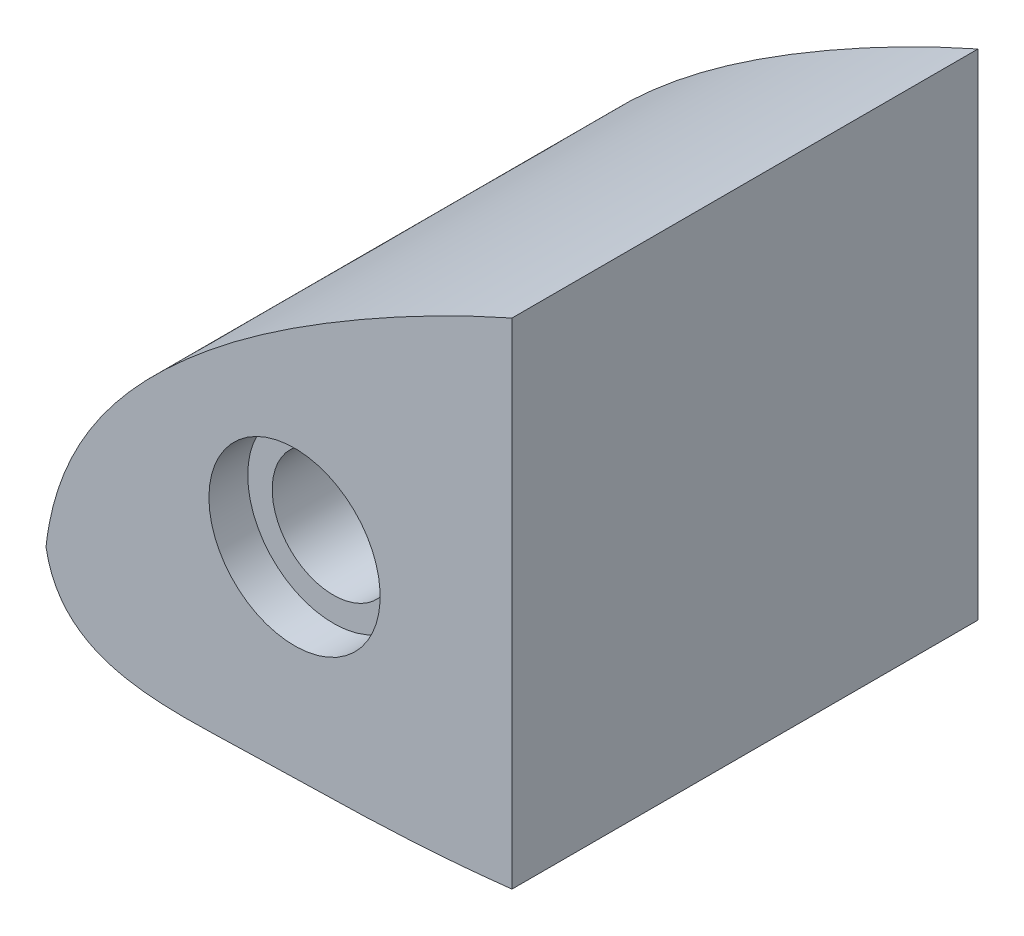
ISO-10303-21;
HEADER;
FILE_DESCRIPTION(('STEP AP214'),'2;1');
FILE_NAME('part.step','',(''),(''),'','','');
FILE_SCHEMA(('AUTOMOTIVE_DESIGN { 1 0 10303 214 1 1 1 1 }'));
ENDSEC;
DATA;
#1=APPLICATION_CONTEXT('core data for automotive mechanical design processes');
#2=APPLICATION_PROTOCOL_DEFINITION('international standard','automotive_design',2000,#1);
#3=PRODUCT_CONTEXT('',#1,'mechanical');
#4=PRODUCT('Part','Part','',(#3));
#5=PRODUCT_RELATED_PRODUCT_CATEGORY('part','',(#4));
#6=PRODUCT_DEFINITION_FORMATION('','',#4);
#7=PRODUCT_DEFINITION_CONTEXT('part definition',#1,'design');
#8=PRODUCT_DEFINITION('design','',#6,#7);
#9=PRODUCT_DEFINITION_SHAPE('','',#8);
#10=(LENGTH_UNIT() NAMED_UNIT(*) SI_UNIT(.MILLI.,.METRE.));
#11=(NAMED_UNIT(*) PLANE_ANGLE_UNIT() SI_UNIT($,.RADIAN.));
#12=(NAMED_UNIT(*) SI_UNIT($,.STERADIAN.) SOLID_ANGLE_UNIT());
#13=UNCERTAINTY_MEASURE_WITH_UNIT(LENGTH_MEASURE(1.E-05),#10,'distance_accuracy_value','');
#14=(GEOMETRIC_REPRESENTATION_CONTEXT(3) GLOBAL_UNCERTAINTY_ASSIGNED_CONTEXT((#13)) GLOBAL_UNIT_ASSIGNED_CONTEXT((#10,
#11,#12)) REPRESENTATION_CONTEXT('',''));
#15=CARTESIAN_POINT('',(0.,0.,0.));
#16=DIRECTION('',(0.,0.,1.));
#17=DIRECTION('',(1.,0.,0.));
#18=AXIS2_PLACEMENT_3D('',#15,#16,#17);
#19=CARTESIAN_POINT('',(0.000560351162113587,0.000130087070423624,38.1));
#20=CARTESIAN_POINT('',(1.23071418869678,-6.92407609127206,38.1));
#21=CARTESIAN_POINT('',(15.3166033306834,-6.18906584099094,38.1));
#22=CARTESIAN_POINT('',(36.4546728163185,-6.09849990105009,38.1));
#23=CARTESIAN_POINT('',(66.5061971849192,-0.586669106973501,38.1));
#24=CARTESIAN_POINT('',(110.497331171581,6.18149522271792,38.1));
#25=CARTESIAN_POINT('',(157.718638091679,9.03065014873911,38.1));
#26=CARTESIAN_POINT('',(205.10142463584,8.83808028186313,38.1));
#27=CARTESIAN_POINT('',(235.858814759408,7.87030619247826,38.1));
#28=CARTESIAN_POINT('',(260.846344817159,5.42741339404395,38.1));
#29=CARTESIAN_POINT('',(276.264022989737,4.51435670375389,38.1));
#30=CARTESIAN_POINT('',(293.989507544058,2.09398731346533,38.1));
#31=CARTESIAN_POINT('',(303.956832564589,1.47095520994628,38.1));
#32=CARTESIAN_POINT('',(309.846313894505,0.000130087070423666,38.1));
#33=B_SPLINE_CURVE_WITH_KNOTS('',3,(#19,#20,#21,#22,#23,#24,#25,#26,#27,#28,#29,#30,#31,#32),
.UNSPECIFIED.,.F.,.F.,(4,1,1,1,1,1,1,1,1,1,1,4),(0.,0.0569078595717698,0.106482711504673,
0.214488052979465,0.341297688349143,0.535095665520157,0.664680853556909,0.794660698192775,
0.828978881532905,0.904725108725214,0.942212919019968,1.),.UNSPECIFIED.);
#34=DIRECTION('',(0.,0.,-1.));
#35=VECTOR('',#34,1.);
#36=SURFACE_OF_LINEAR_EXTRUSION('',#33,#35);
#37=CARTESIAN_POINT('',(0.000560351162113587,0.000130087070423624,0.));
#38=CARTESIAN_POINT('',(1.23071418869678,-6.92407609127206,0.));
#39=CARTESIAN_POINT('',(15.3166033306834,-6.18906584099094,0.));
#40=CARTESIAN_POINT('',(36.4546728163185,-6.09849990105009,0.));
#41=CARTESIAN_POINT('',(66.5061971849192,-0.586669106973501,0.));
#42=CARTESIAN_POINT('',(110.497331171581,6.18149522271792,0.));
#43=CARTESIAN_POINT('',(157.718638091679,9.03065014873911,0.));
#44=CARTESIAN_POINT('',(205.10142463584,8.83808028186313,0.));
#45=CARTESIAN_POINT('',(235.858814759408,7.87030619247826,0.));
#46=CARTESIAN_POINT('',(260.846344817159,5.42741339404395,0.));
#47=CARTESIAN_POINT('',(276.264022989737,4.51435670375389,0.));
#48=CARTESIAN_POINT('',(293.989507544058,2.09398731346533,0.));
#49=CARTESIAN_POINT('',(303.956832564589,1.47095520994628,0.));
#50=CARTESIAN_POINT('',(309.846313894505,0.000130087070423666,0.));
#51=B_SPLINE_CURVE_WITH_KNOTS('',3,(#37,#38,#39,#40,#41,#42,#43,#44,#45,#46,#47,#48,#49,#50),
.UNSPECIFIED.,.F.,.F.,(4,1,1,1,1,1,1,1,1,1,1,4),(0.,0.0569078595717698,0.106482711504673,
0.214488052979465,0.341297688349143,0.535095665520157,0.664680853556909,0.794660698192775,
0.828978881532905,0.904725108725214,0.942212919019968,1.),.UNSPECIFIED.);
#52=CARTESIAN_POINT('',(0.000560351162116727,0.000130087070423829,0.));
#53=VERTEX_POINT('',#52);
#54=CARTESIAN_POINT('',(38.0999999979874,-5.18097252426853,0.));
#55=VERTEX_POINT('',#54);
#56=EDGE_CURVE('E100',#53,#55,#51,.T.);
#57=ORIENTED_EDGE('',*,*,#56,.T.);
#58=DIRECTION('',(0.,0.,-1.));
#59=VECTOR('',#58,1.);
#60=CARTESIAN_POINT('',(38.1,-5.18097252404465,38.1));
#61=LINE('',#60,#59);
#62=CARTESIAN_POINT('',(38.1,-5.18097252426854,38.1));
#63=VERTEX_POINT('',#62);
#64=EDGE_CURVE('E55',#55,#63,#61,.F.);
#65=ORIENTED_EDGE('',*,*,#64,.T.);
#66=CARTESIAN_POINT('',(0.000560351162116727,0.000130087070423829,38.1));
#67=VERTEX_POINT('',#66);
#68=EDGE_CURVE('E84',#67,#63,#33,.T.);
#69=ORIENTED_EDGE('',*,*,#68,.F.);
#70=DIRECTION('',(0.,0.,-1.));
#71=VECTOR('',#70,1.);
#72=CARTESIAN_POINT('',(0.000560351162116727,0.000130087070423829,38.1));
#73=LINE('',#72,#71);
#74=EDGE_CURVE('E11',#67,#53,#73,.T.);
#75=ORIENTED_EDGE('',*,*,#74,.T.);
#76=EDGE_LOOP('',(#57,#65,#69,#75));
#77=FACE_BOUND('',#76,.T.);
#78=ADVANCED_FACE('F38',(#77),#36,.F.);
#79=CARTESIAN_POINT('',(309.846313894505,0.000130087070423864,38.1));
#80=CARTESIAN_POINT('',(314.816918223261,-0.51620674157964,38.1));
#81=CARTESIAN_POINT('',(301.273197720551,4.38282813873556,38.1));
#82=CARTESIAN_POINT('',(290.359837670022,8.71099439045776,38.1));
#83=CARTESIAN_POINT('',(256.952064400645,19.5289209482833,38.1));
#84=CARTESIAN_POINT('',(217.961060472083,29.6129748944238,38.1));
#85=CARTESIAN_POINT('',(173.256699242147,40.0411042779434,38.1));
#86=CARTESIAN_POINT('',(131.400792108858,47.8848319151037,38.1));
#87=CARTESIAN_POINT('',(89.5976184754884,49.290763053775,38.1));
#88=CARTESIAN_POINT('',(52.1111282710831,42.0692152748914,38.1));
#89=CARTESIAN_POINT('',(26.2867198183782,29.9751763284633,38.1));
#90=CARTESIAN_POINT('',(8.64909202481883,17.8566051741579,38.1));
#91=CARTESIAN_POINT('',(0.810633126632263,7.35919605469637,38.1));
#92=CARTESIAN_POINT('',(0.000560351162116727,0.000130087070423829,38.1));
#93=B_SPLINE_CURVE_WITH_KNOTS('',3,(#79,#80,#81,#82,#83,#84,#85,#86,#87,#88,#89,#90,#91,#92),
.UNSPECIFIED.,.F.,.F.,(4,1,1,1,1,1,1,1,1,1,1,4),(0.,0.0239417713693992,0.070244030177139,
0.147561721425381,0.308455887006792,0.442387865106874,0.551517565626309,0.687091076796298,
0.811391258419108,0.886311735305172,0.939136382225768,1.),.UNSPECIFIED.);
#94=DIRECTION('',(0.,0.,-1.));
#95=VECTOR('',#94,1.);
#96=SURFACE_OF_LINEAR_EXTRUSION('',#93,#95);
#97=CARTESIAN_POINT('',(38.1,35.2581330206231,38.1));
#98=VERTEX_POINT('',#97);
#99=EDGE_CURVE('E48',#98,#67,#93,.T.);
#100=ORIENTED_EDGE('',*,*,#99,.F.);
#101=DIRECTION('',(0.,0.,-1.));
#102=VECTOR('',#101,1.);
#103=CARTESIAN_POINT('',(38.1,35.2581330224171,38.1));
#104=LINE('',#103,#102);
#105=CARTESIAN_POINT('',(38.1,35.2581330206231,0.));
#106=VERTEX_POINT('',#105);
#107=EDGE_CURVE('E74',#98,#106,#104,.T.);
#108=ORIENTED_EDGE('',*,*,#107,.T.);
#109=CARTESIAN_POINT('',(309.846313894505,0.000130087070423864,0.));
#110=CARTESIAN_POINT('',(314.816918223261,-0.51620674157964,0.));
#111=CARTESIAN_POINT('',(301.273197720551,4.38282813873556,0.));
#112=CARTESIAN_POINT('',(290.359837670022,8.71099439045776,0.));
#113=CARTESIAN_POINT('',(256.952064400645,19.5289209482833,0.));
#114=CARTESIAN_POINT('',(217.961060472083,29.6129748944238,0.));
#115=CARTESIAN_POINT('',(173.256699242147,40.0411042779434,0.));
#116=CARTESIAN_POINT('',(131.400792108858,47.8848319151037,0.));
#117=CARTESIAN_POINT('',(89.5976184754884,49.290763053775,0.));
#118=CARTESIAN_POINT('',(52.1111282710831,42.0692152748914,0.));
#119=CARTESIAN_POINT('',(26.2867198183782,29.9751763284633,0.));
#120=CARTESIAN_POINT('',(8.64909202481883,17.8566051741579,0.));
#121=CARTESIAN_POINT('',(0.810633126632263,7.35919605469637,0.));
#122=CARTESIAN_POINT('',(0.000560351162116727,0.000130087070423829,0.));
#123=B_SPLINE_CURVE_WITH_KNOTS('',3,(#109,#110,#111,#112,#113,#114,#115,#116,#117,#118,#119,
#120,#121,#122),.UNSPECIFIED.,.F.,.F.,(4,1,1,1,1,1,1,1,1,1,1,4),(0.,0.0239417713693992,
0.070244030177139,0.147561721425381,0.308455887006792,0.442387865106874,0.551517565626309,
0.687091076796298,0.811391258419108,0.886311735305172,0.939136382225768,1.),.UNSPECIFIED.);
#124=EDGE_CURVE('E91',#106,#53,#123,.T.);
#125=ORIENTED_EDGE('',*,*,#124,.T.);
#126=ORIENTED_EDGE('',*,*,#74,.F.);
#127=EDGE_LOOP('',(#100,#108,#125,#126));
#128=FACE_BOUND('',#127,.T.);
#129=ADVANCED_FACE('F87',(#128),#96,.F.);
#130=CARTESIAN_POINT('',(153.387816973495,8.33338198857885,38.1));
#131=DIRECTION('',(0.,0.,-1.));
#132=DIRECTION('',(-1.,0.,0.));
#133=AXIS2_PLACEMENT_3D('',#130,#131,#132);
#134=PLANE('',#133);
#135=CARTESIAN_POINT('',(20.32,10.16,38.1));
#136=DIRECTION('',(0.,0.,-1.));
#137=DIRECTION('',(-1.,0.,0.));
#138=AXIS2_PLACEMENT_3D('',#135,#136,#137);
#139=CIRCLE('',#138,7.);
#140=CARTESIAN_POINT('',(13.32,10.16,38.1));
#141=VERTEX_POINT('',#140);
#142=EDGE_CURVE('E151',#141,#141,#139,.T.);
#143=ORIENTED_EDGE('',*,*,#142,.T.);
#144=EDGE_LOOP('',(#143));
#145=FACE_BOUND('',#144,.T.);
#146=ORIENTED_EDGE('',*,*,#68,.T.);
#147=DIRECTION('',(0.,-1.,0.));
#148=VECTOR('',#147,1.);
#149=CARTESIAN_POINT('',(38.1,71.7179988353335,38.1));
#150=LINE('',#149,#148);
#151=EDGE_CURVE('E76',#98,#63,#150,.T.);
#152=ORIENTED_EDGE('',*,*,#151,.F.);
#153=ORIENTED_EDGE('',*,*,#99,.T.);
#154=EDGE_LOOP('',(#146,#152,#153));
#155=FACE_BOUND('',#154,.T.);
#156=ADVANCED_FACE('F82',(#145,#155),#134,.F.);
#157=CARTESIAN_POINT('',(153.387816973495,8.33338198857885,0.));
#158=DIRECTION('',(0.,0.,-1.));
#159=DIRECTION('',(-1.,0.,0.));
#160=AXIS2_PLACEMENT_3D('',#157,#158,#159);
#161=PLANE('',#160);
#162=DIRECTION('',(0.,-1.,0.));
#163=VECTOR('',#162,1.);
#164=CARTESIAN_POINT('',(38.1,71.7179988353335,0.));
#165=LINE('',#164,#163);
#166=EDGE_CURVE('E77',#106,#55,#165,.T.);
#167=ORIENTED_EDGE('',*,*,#166,.T.);
#168=ORIENTED_EDGE('',*,*,#56,.F.);
#169=ORIENTED_EDGE('',*,*,#124,.F.);
#170=EDGE_LOOP('',(#167,#168,#169));
#171=FACE_BOUND('',#170,.T.);
#172=CARTESIAN_POINT('',(20.32,10.16,0.));
#173=DIRECTION('',(0.,0.,1.));
#174=DIRECTION('',(1.,0.,0.));
#175=AXIS2_PLACEMENT_3D('',#172,#173,#174);
#176=CIRCLE('',#175,5.);
#177=CARTESIAN_POINT('',(25.32,10.16,0.));
#178=VERTEX_POINT('',#177);
#179=EDGE_CURVE('E140',#178,#178,#176,.T.);
#180=ORIENTED_EDGE('',*,*,#179,.T.);
#181=EDGE_LOOP('',(#180));
#182=FACE_BOUND('',#181,.T.);
#183=ADVANCED_FACE('F109',(#171,#182),#161,.T.);
#184=CARTESIAN_POINT('',(20.32,10.16,0.));
#185=DIRECTION('',(0.,0.,1.));
#186=DIRECTION('',(1.,0.,0.));
#187=AXIS2_PLACEMENT_3D('',#184,#185,#186);
#188=CYLINDRICAL_SURFACE('',#187,5.);
#189=CARTESIAN_POINT('',(20.32,10.16,34.925));
#190=DIRECTION('',(0.,0.,-1.));
#191=DIRECTION('',(-1.,0.,0.));
#192=AXIS2_PLACEMENT_3D('',#189,#190,#191);
#193=CIRCLE('',#192,5.);
#194=CARTESIAN_POINT('',(25.32,10.16,34.925));
#195=VERTEX_POINT('',#194);
#196=EDGE_CURVE('E42',#195,#195,#193,.F.);
#197=CARTESIAN_POINT('',(25.32,10.16,34.925));
#198=CARTESIAN_POINT('',(25.32,10.16,34.5611979166667));
#199=CARTESIAN_POINT('',(25.32,10.16,34.1973958333333));
#200=CARTESIAN_POINT('',(25.32,10.16,33.4697916666667));
#201=CARTESIAN_POINT('',(25.32,10.16,33.1059895833333));
#202=CARTESIAN_POINT('',(25.32,10.16,32.3783854166667));
#203=CARTESIAN_POINT('',(25.32,10.16,32.0145833333333));
#204=CARTESIAN_POINT('',(25.32,10.16,31.2869791666667));
#205=CARTESIAN_POINT('',(25.32,10.16,30.9231770833333));
#206=CARTESIAN_POINT('',(25.32,10.16,30.1955729166667));
#207=CARTESIAN_POINT('',(25.32,10.16,29.8317708333333));
#208=CARTESIAN_POINT('',(25.32,10.16,29.1041666666667));
#209=CARTESIAN_POINT('',(25.32,10.16,28.7403645833333));
#210=CARTESIAN_POINT('',(25.32,10.16,28.0127604166667));
#211=CARTESIAN_POINT('',(25.32,10.16,27.6489583333333));
#212=CARTESIAN_POINT('',(25.32,10.16,26.9213541666667));
#213=CARTESIAN_POINT('',(25.32,10.16,26.5575520833333));
#214=CARTESIAN_POINT('',(25.32,10.16,25.8299479166667));
#215=CARTESIAN_POINT('',(25.32,10.16,25.4661458333333));
#216=CARTESIAN_POINT('',(25.32,10.16,24.7385416666667));
#217=CARTESIAN_POINT('',(25.32,10.16,24.3747395833333));
#218=CARTESIAN_POINT('',(25.32,10.16,23.6471354166667));
#219=CARTESIAN_POINT('',(25.32,10.16,23.2833333333333));
#220=CARTESIAN_POINT('',(25.32,10.16,22.5557291666667));
#221=CARTESIAN_POINT('',(25.32,10.16,22.1919270833333));
#222=CARTESIAN_POINT('',(25.32,10.16,21.4643229166667));
#223=CARTESIAN_POINT('',(25.32,10.16,21.1005208333333));
#224=CARTESIAN_POINT('',(25.32,10.16,20.3729166666667));
#225=CARTESIAN_POINT('',(25.32,10.16,20.0091145833333));
#226=CARTESIAN_POINT('',(25.32,10.16,19.2815104166667));
#227=CARTESIAN_POINT('',(25.32,10.16,18.9177083333333));
#228=CARTESIAN_POINT('',(25.32,10.16,18.1901041666667));
#229=CARTESIAN_POINT('',(25.32,10.16,17.8263020833333));
#230=CARTESIAN_POINT('',(25.32,10.16,17.0986979166667));
#231=CARTESIAN_POINT('',(25.32,10.16,16.7348958333333));
#232=CARTESIAN_POINT('',(25.32,10.16,16.0072916666667));
#233=CARTESIAN_POINT('',(25.32,10.16,15.6434895833333));
#234=CARTESIAN_POINT('',(25.32,10.16,14.9158854166667));
#235=CARTESIAN_POINT('',(25.32,10.16,14.5520833333333));
#236=CARTESIAN_POINT('',(25.32,10.16,13.8244791666667));
#237=CARTESIAN_POINT('',(25.32,10.16,13.4606770833333));
#238=CARTESIAN_POINT('',(25.32,10.16,12.7330729166667));
#239=CARTESIAN_POINT('',(25.32,10.16,12.3692708333333));
#240=CARTESIAN_POINT('',(25.32,10.16,11.6416666666667));
#241=CARTESIAN_POINT('',(25.32,10.16,11.2778645833333));
#242=CARTESIAN_POINT('',(25.32,10.16,10.5502604166667));
#243=CARTESIAN_POINT('',(25.32,10.16,10.1864583333333));
#244=CARTESIAN_POINT('',(25.32,10.16,9.45885416666667));
#245=CARTESIAN_POINT('',(25.32,10.16,9.09505208333333));
#246=CARTESIAN_POINT('',(25.32,10.16,8.36744791666667));
#247=CARTESIAN_POINT('',(25.32,10.16,8.00364583333334));
#248=CARTESIAN_POINT('',(25.32,10.16,7.27604166666667));
#249=CARTESIAN_POINT('',(25.32,10.16,6.91223958333334));
#250=CARTESIAN_POINT('',(25.32,10.16,6.18463541666667));
#251=CARTESIAN_POINT('',(25.32,10.16,5.82083333333333));
#252=CARTESIAN_POINT('',(25.32,10.16,5.09322916666667));
#253=CARTESIAN_POINT('',(25.32,10.16,4.72942708333333));
#254=CARTESIAN_POINT('',(25.32,10.16,4.00182291666667));
#255=CARTESIAN_POINT('',(25.32,10.16,3.63802083333333));
#256=CARTESIAN_POINT('',(25.32,10.16,2.91041666666667));
#257=CARTESIAN_POINT('',(25.32,10.16,2.54661458333333));
#258=CARTESIAN_POINT('',(25.32,10.16,1.81901041666667));
#259=CARTESIAN_POINT('',(25.32,10.16,1.45520833333333));
#260=CARTESIAN_POINT('',(25.32,10.16,0.727604166666668));
#261=CARTESIAN_POINT('',(25.32,10.16,0.363802083333334));
#262=CARTESIAN_POINT('',(25.32,10.16,0.));
#263=B_SPLINE_CURVE_WITH_KNOTS('',3,(#197,#198,#199,#200,#201,#202,#203,#204,#205,#206,#207,
#208,#209,#210,#211,#212,#213,#214,#215,#216,#217,#218,#219,#220,#221,#222,#223,#224,#225,#226,
#227,#228,#229,#230,#231,#232,#233,#234,#235,#236,#237,#238,#239,#240,#241,#242,#243,#244,#245,
#246,#247,#248,#249,#250,#251,#252,#253,#254,#255,#256,#257,#258,#259,#260,#261,#262),
.UNSPECIFIED.,.F.,.F.,(4,2,2,2,2,2,2,2,2,2,2,2,2,2,2,2,2,2,2,2,2,2,2,2,2,2,2,2,2,2,2,2,4),(0.,
1.09140625,2.1828125,3.27421875,4.365625,5.45703125,6.5484375,7.63984375,8.73125,9.82265625,
10.9140625,12.00546875,13.096875,14.18828125,15.2796875,16.37109375,17.4625,18.55390625,
19.6453125,20.73671875,21.828125,22.91953125,24.0109375,25.10234375,26.19375,27.28515625,
28.3765625,29.46796875,30.559375,31.65078125,32.7421875,33.83359375,34.925),.UNSPECIFIED.);
#264=EDGE_CURVE('BSEAM112',#195,#178,#263,.T.);
#265=ORIENTED_EDGE('',*,*,#196,.T.);
#266=ORIENTED_EDGE('',*,*,#179,.F.);
#267=ORIENTED_EDGE('',*,*,#264,.T.);
#268=ORIENTED_EDGE('',*,*,#264,.F.);
#269=EDGE_LOOP('',(#265,#267,#266,#268));
#270=FACE_BOUND('',#269,.T.);
#271=ADVANCED_FACE('F112',(#270),#188,.F.);
#272=CARTESIAN_POINT('',(38.1,71.7179988353335,0.));
#273=DIRECTION('',(-1.,0.,0.));
#274=DIRECTION('',(0.,-1.,0.));
#275=AXIS2_PLACEMENT_3D('',#272,#273,#274);
#276=PLANE('',#275);
#277=ORIENTED_EDGE('',*,*,#166,.F.);
#278=ORIENTED_EDGE('',*,*,#107,.F.);
#279=ORIENTED_EDGE('',*,*,#151,.T.);
#280=ORIENTED_EDGE('',*,*,#64,.F.);
#281=EDGE_LOOP('',(#277,#278,#279,#280));
#282=FACE_BOUND('',#281,.T.);
#283=ADVANCED_FACE('F75',(#282),#276,.F.);
#284=CARTESIAN_POINT('',(20.32,10.16,34.925));
#285=DIRECTION('',(0.,0.,-1.));
#286=DIRECTION('',(-1.,0.,0.));
#287=AXIS2_PLACEMENT_3D('',#284,#285,#286);
#288=PLANE('',#287);
#289=CARTESIAN_POINT('',(20.32,10.16,34.925));
#290=DIRECTION('',(0.,0.,-1.));
#291=DIRECTION('',(-1.,0.,0.));
#292=AXIS2_PLACEMENT_3D('',#289,#290,#291);
#293=CIRCLE('',#292,7.);
#294=CARTESIAN_POINT('',(13.32,10.16,34.925));
#295=VERTEX_POINT('',#294);
#296=EDGE_CURVE('E155',#295,#295,#293,.T.);
#297=ORIENTED_EDGE('',*,*,#296,.F.);
#298=EDGE_LOOP('',(#297));
#299=FACE_BOUND('',#298,.T.);
#300=ORIENTED_EDGE('',*,*,#196,.F.);
#301=EDGE_LOOP('',(#300));
#302=FACE_BOUND('',#301,.T.);
#303=ADVANCED_FACE('F122',(#299,#302),#288,.F.);
#304=CARTESIAN_POINT('',(20.32,10.16,34.925));
#305=DIRECTION('',(0.,0.,1.));
#306=DIRECTION('',(1.,0.,0.));
#307=AXIS2_PLACEMENT_3D('',#304,#305,#306);
#308=CYLINDRICAL_SURFACE('',#307,7.);
#309=ORIENTED_EDGE('',*,*,#296,.T.);
#310=EDGE_LOOP('',(#309));
#311=FACE_BOUND('',#310,.T.);
#312=ORIENTED_EDGE('',*,*,#142,.F.);
#313=EDGE_LOOP('',(#312));
#314=FACE_BOUND('',#313,.T.);
#315=ADVANCED_FACE('F123',(#311,#314),#308,.F.);
#316=CLOSED_SHELL('',(#78,#129,#156,#183,#271,#283,#303,#315));
#317=MANIFOLD_SOLID_BREP('B2',#316);
#318=ADVANCED_BREP_SHAPE_REPRESENTATION('',(#18,#317),#14);
#319=SHAPE_DEFINITION_REPRESENTATION(#9,#318);
ENDSEC;
END-ISO-10303-21;
